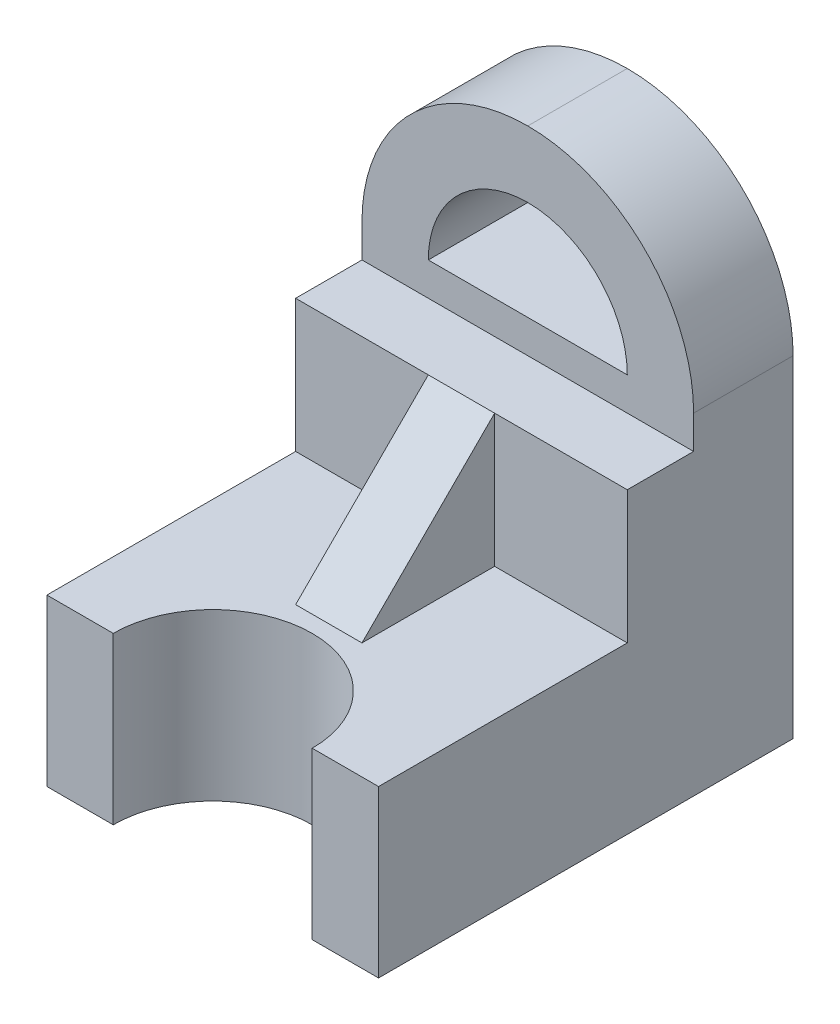
ISO-10303-21;
HEADER;
FILE_DESCRIPTION(('STEP AP214'),'2;1');
FILE_NAME('part.step','',(''),(''),'','','');
FILE_SCHEMA(('AUTOMOTIVE_DESIGN { 1 0 10303 214 1 1 1 1 }'));
ENDSEC;
DATA;
#1=APPLICATION_CONTEXT('core data for automotive mechanical design processes');
#2=APPLICATION_PROTOCOL_DEFINITION('international standard','automotive_design',2000,#1);
#3=PRODUCT_CONTEXT('',#1,'mechanical');
#4=PRODUCT('Part','Part','',(#3));
#5=PRODUCT_RELATED_PRODUCT_CATEGORY('part','',(#4));
#6=PRODUCT_DEFINITION_FORMATION('','',#4);
#7=PRODUCT_DEFINITION_CONTEXT('part definition',#1,'design');
#8=PRODUCT_DEFINITION('design','',#6,#7);
#9=PRODUCT_DEFINITION_SHAPE('','',#8);
#10=(LENGTH_UNIT() NAMED_UNIT(*) SI_UNIT(.MILLI.,.METRE.));
#11=(NAMED_UNIT(*) PLANE_ANGLE_UNIT() SI_UNIT($,.RADIAN.));
#12=(NAMED_UNIT(*) SI_UNIT($,.STERADIAN.) SOLID_ANGLE_UNIT());
#13=UNCERTAINTY_MEASURE_WITH_UNIT(LENGTH_MEASURE(1.E-05),#10,'distance_accuracy_value','');
#14=(GEOMETRIC_REPRESENTATION_CONTEXT(3) GLOBAL_UNCERTAINTY_ASSIGNED_CONTEXT((#13)) GLOBAL_UNIT_ASSIGNED_CONTEXT((#10,
#11,#12)) REPRESENTATION_CONTEXT('',''));
#15=CARTESIAN_POINT('',(0.,0.,0.));
#16=DIRECTION('',(0.,0.,1.));
#17=DIRECTION('',(1.,0.,0.));
#18=AXIS2_PLACEMENT_3D('',#15,#16,#17);
#19=CARTESIAN_POINT('',(-50.,90.,-12.5));
#20=DIRECTION('',(0.,0.,-1.));
#21=DIRECTION('',(-1.,0.,0.));
#22=AXIS2_PLACEMENT_3D('',#19,#20,#21);
#23=PLANE('',#22);
#24=DIRECTION('',(0.,1.,0.));
#25=VECTOR('',#24,1.);
#26=CARTESIAN_POINT('',(10.,50.,-12.5));
#27=LINE('',#26,#25);
#28=CARTESIAN_POINT('',(10.,50.,-12.5));
#29=VERTEX_POINT('',#28);
#30=CARTESIAN_POINT('',(10.,90.,-12.5));
#31=VERTEX_POINT('',#30);
#32=EDGE_CURVE('E164',#29,#31,#27,.T.);
#33=ORIENTED_EDGE('',*,*,#32,.F.);
#34=DIRECTION('',(-1.,0.,0.));
#35=VECTOR('',#34,1.);
#36=CARTESIAN_POINT('',(0.,50.,-12.5));
#37=LINE('',#36,#35);
#38=CARTESIAN_POINT('',(50.,50.,-12.5));
#39=VERTEX_POINT('',#38);
#40=EDGE_CURVE('E250',#39,#29,#37,.T.);
#41=ORIENTED_EDGE('',*,*,#40,.F.);
#42=DIRECTION('',(0.,-1.,0.));
#43=VECTOR('',#42,1.);
#44=CARTESIAN_POINT('',(50.,90.,-12.5));
#45=LINE('',#44,#43);
#46=CARTESIAN_POINT('',(50.,90.,-12.5));
#47=VERTEX_POINT('',#46);
#48=EDGE_CURVE('E199',#47,#39,#45,.T.);
#49=ORIENTED_EDGE('',*,*,#48,.F.);
#50=DIRECTION('',(1.,0.,0.));
#51=VECTOR('',#50,1.);
#52=CARTESIAN_POINT('',(-50.,90.,-12.5));
#53=LINE('',#52,#51);
#54=EDGE_CURVE('E195',#31,#47,#53,.T.);
#55=ORIENTED_EDGE('',*,*,#54,.F.);
#56=EDGE_LOOP('',(#33,#41,#49,#55));
#57=FACE_BOUND('',#56,.T.);
#58=ADVANCED_FACE('F39',(#57),#23,.F.);
#59=CARTESIAN_POINT('',(0.,50.,62.5));
#60=DIRECTION('',(0.,1.,0.));
#61=DIRECTION('',(0.,0.,1.));
#62=AXIS2_PLACEMENT_3D('',#59,#60,#61);
#63=PLANE('',#62);
#64=DIRECTION('',(-1.,0.,0.));
#65=VECTOR('',#64,1.);
#66=CARTESIAN_POINT('',(10.,50.,27.5000000000004));
#67=LINE('',#66,#65);
#68=CARTESIAN_POINT('',(10.,50.,27.5000000000004));
#69=VERTEX_POINT('',#68);
#70=CARTESIAN_POINT('',(-10.,50.,27.5000000000004));
#71=VERTEX_POINT('',#70);
#72=EDGE_CURVE('E175',#69,#71,#67,.T.);
#73=ORIENTED_EDGE('',*,*,#72,.T.);
#74=DIRECTION('',(0.,0.,-1.));
#75=VECTOR('',#74,1.);
#76=CARTESIAN_POINT('',(-10.,50.,27.5000000000004));
#77=LINE('',#76,#75);
#78=CARTESIAN_POINT('',(-10.,50.,-12.5));
#79=VERTEX_POINT('',#78);
#80=EDGE_CURVE('E166',#71,#79,#77,.T.);
#81=ORIENTED_EDGE('',*,*,#80,.T.);
#82=CARTESIAN_POINT('',(-50.,50.,-12.5));
#83=VERTEX_POINT('',#82);
#84=EDGE_CURVE('E249',#79,#83,#37,.T.);
#85=ORIENTED_EDGE('',*,*,#84,.T.);
#86=DIRECTION('',(0.,0.,1.));
#87=VECTOR('',#86,1.);
#88=CARTESIAN_POINT('',(-50.,50.,-62.5));
#89=LINE('',#88,#87);
#90=CARTESIAN_POINT('',(-50.,50.,62.5));
#91=VERTEX_POINT('',#90);
#92=EDGE_CURVE('E209',#83,#91,#89,.T.);
#93=ORIENTED_EDGE('',*,*,#92,.T.);
#94=DIRECTION('',(1.,0.,0.));
#95=VECTOR('',#94,1.);
#96=CARTESIAN_POINT('',(-50.,50.,62.5));
#97=LINE('',#96,#95);
#98=CARTESIAN_POINT('',(-30.,50.,62.5));
#99=VERTEX_POINT('',#98);
#100=EDGE_CURVE('E213',#91,#99,#97,.T.);
#101=ORIENTED_EDGE('',*,*,#100,.T.);
#102=CARTESIAN_POINT('',(0.,50.,62.5));
#103=DIRECTION('',(0.,-1.,0.));
#104=DIRECTION('',(0.,0.,1.));
#105=AXIS2_PLACEMENT_3D('',#102,#103,#104);
#106=CIRCLE('',#105,30.);
#107=CARTESIAN_POINT('',(30.,50.,62.5));
#108=VERTEX_POINT('',#107);
#109=EDGE_CURVE('E214',#99,#108,#106,.T.);
#110=ORIENTED_EDGE('',*,*,#109,.T.);
#111=DIRECTION('',(1.,0.,0.));
#112=VECTOR('',#111,1.);
#113=CARTESIAN_POINT('',(30.,50.,62.5));
#114=LINE('',#113,#112);
#115=CARTESIAN_POINT('',(50.,50.,62.5));
#116=VERTEX_POINT('',#115);
#117=EDGE_CURVE('E220',#108,#116,#114,.T.);
#118=ORIENTED_EDGE('',*,*,#117,.T.);
#119=DIRECTION('',(0.,0.,-1.));
#120=VECTOR('',#119,1.);
#121=CARTESIAN_POINT('',(50.,50.,-62.5));
#122=LINE('',#121,#120);
#123=EDGE_CURVE('E210',#116,#39,#122,.T.);
#124=ORIENTED_EDGE('',*,*,#123,.T.);
#125=ORIENTED_EDGE('',*,*,#40,.T.);
#126=DIRECTION('',(0.,0.,-1.));
#127=VECTOR('',#126,1.);
#128=CARTESIAN_POINT('',(10.,50.,27.5000000000004));
#129=LINE('',#128,#127);
#130=EDGE_CURVE('E174',#69,#29,#129,.T.);
#131=ORIENTED_EDGE('',*,*,#130,.F.);
#132=EDGE_LOOP('',(#73,#81,#85,#93,#101,#110,#118,#124,#125,#131));
#133=FACE_BOUND('',#132,.T.);
#134=ADVANCED_FACE('F307',(#133),#63,.T.);
#135=CARTESIAN_POINT('',(0.,90.,0.));
#136=DIRECTION('',(0.,1.,0.));
#137=DIRECTION('',(0.,0.,1.));
#138=AXIS2_PLACEMENT_3D('',#135,#136,#137);
#139=PLANE('',#138);
#140=DIRECTION('',(0.,0.,-1.));
#141=VECTOR('',#140,1.);
#142=CARTESIAN_POINT('',(50.,90.,-62.5));
#143=LINE('',#142,#141);
#144=CARTESIAN_POINT('',(50.,90.,-32.5));
#145=VERTEX_POINT('',#144);
#146=EDGE_CURVE('E197',#47,#145,#143,.T.);
#147=ORIENTED_EDGE('',*,*,#146,.T.);
#148=DIRECTION('',(-1.,0.,0.));
#149=VECTOR('',#148,1.);
#150=CARTESIAN_POINT('',(0.,90.,-32.5));
#151=LINE('',#150,#149);
#152=CARTESIAN_POINT('',(-50.,90.,-32.5));
#153=VERTEX_POINT('',#152);
#154=EDGE_CURVE('E253',#145,#153,#151,.T.);
#155=ORIENTED_EDGE('',*,*,#154,.T.);
#156=DIRECTION('',(0.,0.,1.));
#157=VECTOR('',#156,1.);
#158=CARTESIAN_POINT('',(-50.,90.,-62.5));
#159=LINE('',#158,#157);
#160=CARTESIAN_POINT('',(-50.,90.,-12.5));
#161=VERTEX_POINT('',#160);
#162=EDGE_CURVE('E192',#153,#161,#159,.T.);
#163=ORIENTED_EDGE('',*,*,#162,.T.);
#164=CARTESIAN_POINT('',(-10.,90.,-12.5));
#165=VERTEX_POINT('',#164);
#166=EDGE_CURVE('E191',#161,#165,#53,.T.);
#167=ORIENTED_EDGE('',*,*,#166,.T.);
#168=DIRECTION('',(-1.,0.,0.));
#169=VECTOR('',#168,1.);
#170=CARTESIAN_POINT('',(10.,90.,-12.5));
#171=LINE('',#170,#169);
#172=EDGE_CURVE('E184',#31,#165,#171,.T.);
#173=ORIENTED_EDGE('',*,*,#172,.F.);
#174=ORIENTED_EDGE('',*,*,#54,.T.);
#175=EDGE_LOOP('',(#147,#155,#163,#167,#173,#174));
#176=FACE_BOUND('',#175,.T.);
#177=ADVANCED_FACE('F312',(#176),#139,.T.);
#178=CARTESIAN_POINT('',(50.,50.,-62.5));
#179=DIRECTION('',(-1.,0.,0.));
#180=DIRECTION('',(0.,0.,1.));
#181=AXIS2_PLACEMENT_3D('',#178,#179,#180);
#182=PLANE('',#181);
#183=DIRECTION('',(0.,-1.,0.));
#184=VECTOR('',#183,1.);
#185=CARTESIAN_POINT('',(50.,50.,-62.5));
#186=LINE('',#185,#184);
#187=CARTESIAN_POINT('',(50.,100.,-62.5));
#188=VERTEX_POINT('',#187);
#189=CARTESIAN_POINT('',(50.,0.,-62.5));
#190=VERTEX_POINT('',#189);
#191=EDGE_CURVE('E242',#188,#190,#186,.T.);
#192=ORIENTED_EDGE('',*,*,#191,.F.);
#193=DIRECTION('',(0.,0.,-1.));
#194=VECTOR('',#193,1.);
#195=CARTESIAN_POINT('',(50.,100.,-32.5));
#196=LINE('',#195,#194);
#197=CARTESIAN_POINT('',(50.,100.,-32.5));
#198=VERTEX_POINT('',#197);
#199=EDGE_CURVE('E264',#188,#198,#196,.F.);
#200=ORIENTED_EDGE('',*,*,#199,.T.);
#201=DIRECTION('',(0.,-1.,0.));
#202=VECTOR('',#201,1.);
#203=CARTESIAN_POINT('',(50.,150.,-32.5));
#204=LINE('',#203,#202);
#205=EDGE_CURVE('E186',#198,#145,#204,.T.);
#206=ORIENTED_EDGE('',*,*,#205,.T.);
#207=ORIENTED_EDGE('',*,*,#146,.F.);
#208=ORIENTED_EDGE('',*,*,#48,.T.);
#209=ORIENTED_EDGE('',*,*,#123,.F.);
#210=DIRECTION('',(0.,-1.,0.));
#211=VECTOR('',#210,1.);
#212=CARTESIAN_POINT('',(50.,50.,62.5));
#213=LINE('',#212,#211);
#214=CARTESIAN_POINT('',(50.,0.,62.5));
#215=VERTEX_POINT('',#214);
#216=EDGE_CURVE('E218',#116,#215,#213,.T.);
#217=ORIENTED_EDGE('',*,*,#216,.T.);
#218=DIRECTION('',(0.,0.,-1.));
#219=VECTOR('',#218,1.);
#220=CARTESIAN_POINT('',(50.,0.,-62.5));
#221=LINE('',#220,#219);
#222=EDGE_CURVE('E206',#215,#190,#221,.T.);
#223=ORIENTED_EDGE('',*,*,#222,.T.);
#224=EDGE_LOOP('',(#192,#200,#206,#207,#208,#209,#217,#223));
#225=FACE_BOUND('',#224,.T.);
#226=ADVANCED_FACE('F319',(#225),#182,.F.);
#227=CARTESIAN_POINT('',(-50.,50.,-62.5));
#228=DIRECTION('',(0.,0.,1.));
#229=DIRECTION('',(1.,0.,0.));
#230=AXIS2_PLACEMENT_3D('',#227,#228,#229);
#231=PLANE('',#230);
#232=DIRECTION('',(1.,0.,0.));
#233=VECTOR('',#232,1.);
#234=CARTESIAN_POINT('',(-30.,100.,-62.5));
#235=LINE('',#234,#233);
#236=CARTESIAN_POINT('',(-30.,100.,-62.5));
#237=VERTEX_POINT('',#236);
#238=CARTESIAN_POINT('',(30.,100.,-62.5));
#239=VERTEX_POINT('',#238);
#240=EDGE_CURVE('E153',#237,#239,#235,.T.);
#241=ORIENTED_EDGE('',*,*,#240,.T.);
#242=CARTESIAN_POINT('',(0.,100.,-62.5));
#243=DIRECTION('',(0.,0.,1.));
#244=DIRECTION('',(1.,0.,0.));
#245=AXIS2_PLACEMENT_3D('',#242,#243,#244);
#246=CIRCLE('',#245,30.);
#247=EDGE_CURVE('E53',#239,#237,#246,.T.);
#248=ORIENTED_EDGE('',*,*,#247,.T.);
#249=EDGE_LOOP('',(#241,#248));
#250=FACE_BOUND('',#249,.T.);
#251=DIRECTION('',(0.,-1.,0.));
#252=VECTOR('',#251,1.);
#253=CARTESIAN_POINT('',(-50.,50.,-62.5));
#254=LINE('',#253,#252);
#255=CARTESIAN_POINT('',(-50.,100.,-62.5));
#256=VERTEX_POINT('',#255);
#257=CARTESIAN_POINT('',(-50.,0.,-62.5));
#258=VERTEX_POINT('',#257);
#259=EDGE_CURVE('E245',#256,#258,#254,.T.);
#260=ORIENTED_EDGE('',*,*,#259,.F.);
#261=CARTESIAN_POINT('',(0.,100.,-62.5));
#262=DIRECTION('',(0.,0.,1.));
#263=DIRECTION('',(1.,0.,0.));
#264=AXIS2_PLACEMENT_3D('',#261,#262,#263);
#265=CIRCLE('',#264,50.);
#266=CARTESIAN_POINT('',(0.,150.,-62.5));
#267=VERTEX_POINT('',#266);
#268=EDGE_CURVE('E263',#256,#267,#265,.F.);
#269=ORIENTED_EDGE('',*,*,#268,.T.);
#270=CARTESIAN_POINT('',(0.,100.,-62.5));
#271=DIRECTION('',(0.,0.,1.));
#272=DIRECTION('',(1.,0.,0.));
#273=AXIS2_PLACEMENT_3D('',#270,#271,#272);
#274=CIRCLE('',#273,50.);
#275=EDGE_CURVE('E261',#267,#188,#274,.F.);
#276=ORIENTED_EDGE('',*,*,#275,.T.);
#277=ORIENTED_EDGE('',*,*,#191,.T.);
#278=DIRECTION('',(-1.,0.,0.));
#279=VECTOR('',#278,1.);
#280=CARTESIAN_POINT('',(-50.,0.,-62.5));
#281=LINE('',#280,#279);
#282=EDGE_CURVE('E225',#190,#258,#281,.T.);
#283=ORIENTED_EDGE('',*,*,#282,.T.);
#284=EDGE_LOOP('',(#260,#269,#276,#277,#283));
#285=FACE_BOUND('',#284,.T.);
#286=ADVANCED_FACE('F157',(#250,#285),#231,.F.);
#287=CARTESIAN_POINT('',(-50.,50.,-62.5));
#288=DIRECTION('',(1.,0.,0.));
#289=DIRECTION('',(0.,0.,-1.));
#290=AXIS2_PLACEMENT_3D('',#287,#288,#289);
#291=PLANE('',#290);
#292=DIRECTION('',(0.,-1.,0.));
#293=VECTOR('',#292,1.);
#294=CARTESIAN_POINT('',(-50.,150.,-32.5));
#295=LINE('',#294,#293);
#296=CARTESIAN_POINT('',(-50.,100.,-32.5));
#297=VERTEX_POINT('',#296);
#298=EDGE_CURVE('E188',#297,#153,#295,.T.);
#299=ORIENTED_EDGE('',*,*,#298,.F.);
#300=DIRECTION('',(0.,0.,1.));
#301=VECTOR('',#300,1.);
#302=CARTESIAN_POINT('',(-50.,100.,-62.5));
#303=LINE('',#302,#301);
#304=EDGE_CURVE('E256',#297,#256,#303,.F.);
#305=ORIENTED_EDGE('',*,*,#304,.T.);
#306=ORIENTED_EDGE('',*,*,#259,.T.);
#307=DIRECTION('',(0.,0.,1.));
#308=VECTOR('',#307,1.);
#309=CARTESIAN_POINT('',(-50.,0.,-62.5));
#310=LINE('',#309,#308);
#311=CARTESIAN_POINT('',(-50.,0.,62.5));
#312=VERTEX_POINT('',#311);
#313=EDGE_CURVE('E223',#258,#312,#310,.T.);
#314=ORIENTED_EDGE('',*,*,#313,.T.);
#315=DIRECTION('',(0.,-1.,0.));
#316=VECTOR('',#315,1.);
#317=CARTESIAN_POINT('',(-50.,50.,62.5));
#318=LINE('',#317,#316);
#319=EDGE_CURVE('E238',#91,#312,#318,.T.);
#320=ORIENTED_EDGE('',*,*,#319,.F.);
#321=ORIENTED_EDGE('',*,*,#92,.F.);
#322=DIRECTION('',(0.,-1.,0.));
#323=VECTOR('',#322,1.);
#324=CARTESIAN_POINT('',(-50.,90.,-12.5));
#325=LINE('',#324,#323);
#326=EDGE_CURVE('E201',#161,#83,#325,.T.);
#327=ORIENTED_EDGE('',*,*,#326,.F.);
#328=ORIENTED_EDGE('',*,*,#162,.F.);
#329=EDGE_LOOP('',(#299,#305,#306,#314,#320,#321,#327,#328));
#330=FACE_BOUND('',#329,.T.);
#331=ADVANCED_FACE('F286',(#330),#291,.F.);
#332=CARTESIAN_POINT('',(-50.,50.,62.5));
#333=DIRECTION('',(0.,0.,-1.));
#334=DIRECTION('',(-1.,0.,0.));
#335=AXIS2_PLACEMENT_3D('',#332,#333,#334);
#336=PLANE('',#335);
#337=DIRECTION('',(1.,0.,0.));
#338=VECTOR('',#337,1.);
#339=CARTESIAN_POINT('',(-50.,0.,62.5));
#340=LINE('',#339,#338);
#341=CARTESIAN_POINT('',(-30.,0.,62.5));
#342=VERTEX_POINT('',#341);
#343=EDGE_CURVE('E226',#312,#342,#340,.T.);
#344=ORIENTED_EDGE('',*,*,#343,.T.);
#345=DIRECTION('',(0.,-1.,0.));
#346=VECTOR('',#345,1.);
#347=CARTESIAN_POINT('',(-30.,50.,62.5));
#348=LINE('',#347,#346);
#349=EDGE_CURVE('E240',#99,#342,#348,.T.);
#350=ORIENTED_EDGE('',*,*,#349,.F.);
#351=ORIENTED_EDGE('',*,*,#100,.F.);
#352=ORIENTED_EDGE('',*,*,#319,.T.);
#353=EDGE_LOOP('',(#344,#350,#351,#352));
#354=FACE_BOUND('',#353,.T.);
#355=ADVANCED_FACE('F305',(#354),#336,.F.);
#356=CARTESIAN_POINT('',(0.,50.,62.5));
#357=DIRECTION('',(0.,-1.,0.));
#358=DIRECTION('',(0.,0.,-1.));
#359=AXIS2_PLACEMENT_3D('',#356,#357,#358);
#360=CYLINDRICAL_SURFACE('',#359,30.);
#361=CARTESIAN_POINT('',(0.,0.,62.5));
#362=DIRECTION('',(0.,-1.,0.));
#363=DIRECTION('',(0.,0.,1.));
#364=AXIS2_PLACEMENT_3D('',#361,#362,#363);
#365=CIRCLE('',#364,30.);
#366=CARTESIAN_POINT('',(30.,0.,62.5));
#367=VERTEX_POINT('',#366);
#368=EDGE_CURVE('E228',#342,#367,#365,.T.);
#369=ORIENTED_EDGE('',*,*,#368,.T.);
#370=DIRECTION('',(0.,-1.,0.));
#371=VECTOR('',#370,1.);
#372=CARTESIAN_POINT('',(30.,50.,62.5));
#373=LINE('',#372,#371);
#374=EDGE_CURVE('E231',#108,#367,#373,.T.);
#375=ORIENTED_EDGE('',*,*,#374,.F.);
#376=ORIENTED_EDGE('',*,*,#109,.F.);
#377=ORIENTED_EDGE('',*,*,#349,.T.);
#378=EDGE_LOOP('',(#369,#375,#376,#377));
#379=FACE_BOUND('',#378,.T.);
#380=ADVANCED_FACE('F327',(#379),#360,.F.);
#381=CARTESIAN_POINT('',(30.,50.,62.5));
#382=DIRECTION('',(0.,0.,-1.));
#383=DIRECTION('',(-1.,0.,0.));
#384=AXIS2_PLACEMENT_3D('',#381,#382,#383);
#385=PLANE('',#384);
#386=DIRECTION('',(1.,0.,0.));
#387=VECTOR('',#386,1.);
#388=CARTESIAN_POINT('',(30.,0.,62.5));
#389=LINE('',#388,#387);
#390=EDGE_CURVE('E211',#367,#215,#389,.T.);
#391=ORIENTED_EDGE('',*,*,#390,.T.);
#392=ORIENTED_EDGE('',*,*,#216,.F.);
#393=ORIENTED_EDGE('',*,*,#117,.F.);
#394=ORIENTED_EDGE('',*,*,#374,.T.);
#395=EDGE_LOOP('',(#391,#392,#393,#394));
#396=FACE_BOUND('',#395,.T.);
#397=ADVANCED_FACE('F324',(#396),#385,.F.);
#398=CARTESIAN_POINT('',(0.,0.,62.5));
#399=DIRECTION('',(0.,1.,0.));
#400=DIRECTION('',(0.,0.,1.));
#401=AXIS2_PLACEMENT_3D('',#398,#399,#400);
#402=PLANE('',#401);
#403=ORIENTED_EDGE('',*,*,#343,.F.);
#404=ORIENTED_EDGE('',*,*,#313,.F.);
#405=ORIENTED_EDGE('',*,*,#282,.F.);
#406=ORIENTED_EDGE('',*,*,#222,.F.);
#407=ORIENTED_EDGE('',*,*,#390,.F.);
#408=ORIENTED_EDGE('',*,*,#368,.F.);
#409=EDGE_LOOP('',(#403,#404,#405,#406,#407,#408));
#410=FACE_BOUND('',#409,.T.);
#411=ADVANCED_FACE('F296',(#410),#402,.F.);
#412=ORIENTED_EDGE('',*,*,#84,.F.);
#413=DIRECTION('',(0.,1.,0.));
#414=VECTOR('',#413,1.);
#415=CARTESIAN_POINT('',(-10.,50.,-12.5));
#416=LINE('',#415,#414);
#417=EDGE_CURVE('E173',#79,#165,#416,.T.);
#418=ORIENTED_EDGE('',*,*,#417,.T.);
#419=ORIENTED_EDGE('',*,*,#166,.F.);
#420=ORIENTED_EDGE('',*,*,#326,.T.);
#421=EDGE_LOOP('',(#412,#418,#419,#420));
#422=FACE_BOUND('',#421,.T.);
#423=ADVANCED_FACE('F272',(#422),#23,.F.);
#424=CARTESIAN_POINT('',(-50.,150.,-32.5));
#425=DIRECTION('',(0.,0.,-1.));
#426=DIRECTION('',(-1.,0.,0.));
#427=AXIS2_PLACEMENT_3D('',#424,#425,#426);
#428=PLANE('',#427);
#429=DIRECTION('',(-1.,0.,0.));
#430=VECTOR('',#429,1.);
#431=CARTESIAN_POINT('',(-50.,100.,-32.5));
#432=LINE('',#431,#430);
#433=CARTESIAN_POINT('',(30.,100.,-32.5));
#434=VERTEX_POINT('',#433);
#435=CARTESIAN_POINT('',(-30.,100.,-32.5));
#436=VERTEX_POINT('',#435);
#437=EDGE_CURVE('E50',#434,#436,#432,.T.);
#438=ORIENTED_EDGE('',*,*,#437,.T.);
#439=CARTESIAN_POINT('',(0.,100.,-32.5));
#440=DIRECTION('',(0.,0.,-1.));
#441=DIRECTION('',(-1.,0.,0.));
#442=AXIS2_PLACEMENT_3D('',#439,#440,#441);
#443=CIRCLE('',#442,30.);
#444=EDGE_CURVE('E11',#436,#434,#443,.T.);
#445=ORIENTED_EDGE('',*,*,#444,.T.);
#446=EDGE_LOOP('',(#438,#445));
#447=FACE_BOUND('',#446,.T.);
#448=CARTESIAN_POINT('',(0.,100.,-32.5));
#449=DIRECTION('',(0.,0.,-1.));
#450=DIRECTION('',(-1.,0.,0.));
#451=AXIS2_PLACEMENT_3D('',#448,#449,#450);
#452=CIRCLE('',#451,50.);
#453=CARTESIAN_POINT('',(0.,150.,-32.5));
#454=VERTEX_POINT('',#453);
#455=EDGE_CURVE('E255',#198,#454,#452,.F.);
#456=ORIENTED_EDGE('',*,*,#455,.T.);
#457=CARTESIAN_POINT('',(0.,100.,-32.5));
#458=DIRECTION('',(0.,0.,-1.));
#459=DIRECTION('',(-1.,0.,0.));
#460=AXIS2_PLACEMENT_3D('',#457,#458,#459);
#461=CIRCLE('',#460,50.);
#462=EDGE_CURVE('E258',#454,#297,#461,.F.);
#463=ORIENTED_EDGE('',*,*,#462,.T.);
#464=ORIENTED_EDGE('',*,*,#298,.T.);
#465=ORIENTED_EDGE('',*,*,#154,.F.);
#466=ORIENTED_EDGE('',*,*,#205,.F.);
#467=EDGE_LOOP('',(#456,#463,#464,#465,#466));
#468=FACE_BOUND('',#467,.T.);
#469=ADVANCED_FACE('F267',(#447,#468),#428,.F.);
#470=CARTESIAN_POINT('',(10.,90.,-12.5));
#471=DIRECTION('',(0.,-0.707106781186551,-0.707106781186544));
#472=DIRECTION('',(0.,0.707106781186544,-0.707106781186551));
#473=AXIS2_PLACEMENT_3D('',#470,#471,#472);
#474=PLANE('',#473);
#475=DIRECTION('',(0.,-0.707106781186544,0.707106781186551));
#476=VECTOR('',#475,1.);
#477=CARTESIAN_POINT('',(-10.,90.,-12.5));
#478=LINE('',#477,#476);
#479=EDGE_CURVE('E179',#165,#71,#478,.T.);
#480=ORIENTED_EDGE('',*,*,#479,.T.);
#481=ORIENTED_EDGE('',*,*,#72,.F.);
#482=DIRECTION('',(0.,-0.707106781186544,0.707106781186551));
#483=VECTOR('',#482,1.);
#484=CARTESIAN_POINT('',(10.,90.,-12.5));
#485=LINE('',#484,#483);
#486=EDGE_CURVE('E169',#31,#69,#485,.T.);
#487=ORIENTED_EDGE('',*,*,#486,.F.);
#488=ORIENTED_EDGE('',*,*,#172,.T.);
#489=EDGE_LOOP('',(#480,#481,#487,#488));
#490=FACE_BOUND('',#489,.T.);
#491=ADVANCED_FACE('F275',(#490),#474,.F.);
#492=CARTESIAN_POINT('',(10.,0.,0.));
#493=DIRECTION('',(-1.,0.,0.));
#494=DIRECTION('',(0.,0.,1.));
#495=AXIS2_PLACEMENT_3D('',#492,#493,#494);
#496=PLANE('',#495);
#497=ORIENTED_EDGE('',*,*,#32,.T.);
#498=ORIENTED_EDGE('',*,*,#486,.T.);
#499=ORIENTED_EDGE('',*,*,#130,.T.);
#500=EDGE_LOOP('',(#497,#498,#499));
#501=FACE_BOUND('',#500,.T.);
#502=ADVANCED_FACE('F443',(#501),#496,.F.);
#503=CARTESIAN_POINT('',(-10.,0.,0.));
#504=DIRECTION('',(-1.,0.,0.));
#505=DIRECTION('',(0.,0.,1.));
#506=AXIS2_PLACEMENT_3D('',#503,#504,#505);
#507=PLANE('',#506);
#508=ORIENTED_EDGE('',*,*,#417,.F.);
#509=ORIENTED_EDGE('',*,*,#80,.F.);
#510=ORIENTED_EDGE('',*,*,#479,.F.);
#511=EDGE_LOOP('',(#508,#509,#510));
#512=FACE_BOUND('',#511,.T.);
#513=ADVANCED_FACE('F453',(#512),#507,.T.);
#514=CARTESIAN_POINT('',(0.,100.,0.));
#515=DIRECTION('',(0.,0.,1.));
#516=DIRECTION('',(1.,0.,0.));
#517=AXIS2_PLACEMENT_3D('',#514,#515,#516);
#518=CYLINDRICAL_SURFACE('',#517,50.);
#519=ORIENTED_EDGE('',*,*,#199,.F.);
#520=ORIENTED_EDGE('',*,*,#275,.F.);
#521=DIRECTION('',(0.,0.,-1.));
#522=VECTOR('',#521,1.);
#523=CARTESIAN_POINT('',(0.,150.,-62.5));
#524=LINE('',#523,#522);
#525=EDGE_CURVE('E162',#454,#267,#524,.T.);
#526=ORIENTED_EDGE('',*,*,#525,.F.);
#527=ORIENTED_EDGE('',*,*,#455,.F.);
#528=EDGE_LOOP('',(#519,#520,#526,#527));
#529=FACE_BOUND('',#528,.T.);
#530=ADVANCED_FACE('F41',(#529),#518,.T.);
#531=CARTESIAN_POINT('',(0.,100.,0.));
#532=DIRECTION('',(0.,0.,-1.));
#533=DIRECTION('',(-1.,0.,0.));
#534=AXIS2_PLACEMENT_3D('',#531,#532,#533);
#535=CYLINDRICAL_SURFACE('',#534,50.);
#536=ORIENTED_EDGE('',*,*,#268,.F.);
#537=ORIENTED_EDGE('',*,*,#304,.F.);
#538=ORIENTED_EDGE('',*,*,#462,.F.);
#539=ORIENTED_EDGE('',*,*,#525,.T.);
#540=EDGE_LOOP('',(#536,#537,#538,#539));
#541=FACE_BOUND('',#540,.T.);
#542=ADVANCED_FACE('F287',(#541),#535,.T.);
#543=CARTESIAN_POINT('',(0.,100.,-62.5));
#544=DIRECTION('',(0.,0.,1.));
#545=DIRECTION('',(1.,0.,0.));
#546=AXIS2_PLACEMENT_3D('',#543,#544,#545);
#547=CYLINDRICAL_SURFACE('',#546,30.);
#548=DIRECTION('',(0.,0.,1.));
#549=VECTOR('',#548,1.);
#550=CARTESIAN_POINT('',(-30.,100.,-62.5));
#551=LINE('',#550,#549);
#552=EDGE_CURVE('E64',#237,#436,#551,.T.);
#553=ORIENTED_EDGE('',*,*,#552,.F.);
#554=ORIENTED_EDGE('',*,*,#247,.F.);
#555=DIRECTION('',(0.,0.,1.));
#556=VECTOR('',#555,1.);
#557=CARTESIAN_POINT('',(30.,100.,-62.5));
#558=LINE('',#557,#556);
#559=EDGE_CURVE('E155',#239,#434,#558,.T.);
#560=ORIENTED_EDGE('',*,*,#559,.T.);
#561=ORIENTED_EDGE('',*,*,#444,.F.);
#562=EDGE_LOOP('',(#553,#554,#560,#561));
#563=FACE_BOUND('',#562,.T.);
#564=ADVANCED_FACE('F147',(#563),#547,.F.);
#565=CARTESIAN_POINT('',(-30.,100.,-62.5));
#566=DIRECTION('',(0.,-1.,0.));
#567=DIRECTION('',(1.,0.,0.));
#568=AXIS2_PLACEMENT_3D('',#565,#566,#567);
#569=PLANE('',#568);
#570=ORIENTED_EDGE('',*,*,#559,.F.);
#571=ORIENTED_EDGE('',*,*,#240,.F.);
#572=ORIENTED_EDGE('',*,*,#552,.T.);
#573=ORIENTED_EDGE('',*,*,#437,.F.);
#574=EDGE_LOOP('',(#570,#571,#572,#573));
#575=FACE_BOUND('',#574,.T.);
#576=ADVANCED_FACE('F156',(#575),#569,.F.);
#577=CLOSED_SHELL('',(#58,#134,#177,#226,#286,#331,#355,#380,#397,#411,#423,#469,#491,#502,#513,
#530,#542,#564,#576));
#578=MANIFOLD_SOLID_BREP('B2',#577);
#579=ADVANCED_BREP_SHAPE_REPRESENTATION('',(#18,#578),#14);
#580=SHAPE_DEFINITION_REPRESENTATION(#9,#579);
ENDSEC;
END-ISO-10303-21;
